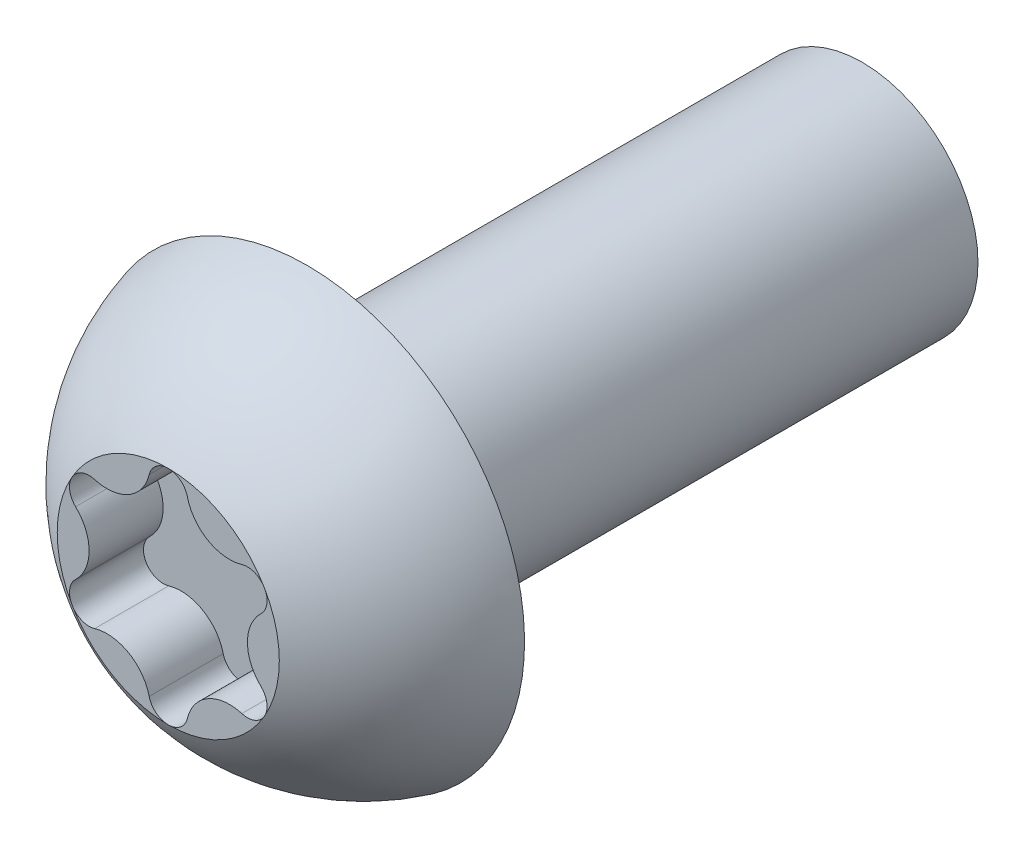
ISO-10303-21;
HEADER;
FILE_DESCRIPTION(('STEP AP214'),'2;1');
FILE_NAME('part.step','',(''),(''),'','','');
FILE_SCHEMA(('AUTOMOTIVE_DESIGN { 1 0 10303 214 1 1 1 1 }'));
ENDSEC;
DATA;
#1=APPLICATION_CONTEXT('core data for automotive mechanical design processes');
#2=APPLICATION_PROTOCOL_DEFINITION('international standard','automotive_design',2000,#1);
#3=PRODUCT_CONTEXT('',#1,'mechanical');
#4=PRODUCT('Part','Part','',(#3));
#5=PRODUCT_RELATED_PRODUCT_CATEGORY('part','',(#4));
#6=PRODUCT_DEFINITION_FORMATION('','',#4);
#7=PRODUCT_DEFINITION_CONTEXT('part definition',#1,'design');
#8=PRODUCT_DEFINITION('design','',#6,#7);
#9=PRODUCT_DEFINITION_SHAPE('','',#8);
#10=(LENGTH_UNIT() NAMED_UNIT(*) SI_UNIT(.MILLI.,.METRE.));
#11=(NAMED_UNIT(*) PLANE_ANGLE_UNIT() SI_UNIT($,.RADIAN.));
#12=(NAMED_UNIT(*) SI_UNIT($,.STERADIAN.) SOLID_ANGLE_UNIT());
#13=UNCERTAINTY_MEASURE_WITH_UNIT(LENGTH_MEASURE(1.E-05),#10,'distance_accuracy_value','');
#14=(GEOMETRIC_REPRESENTATION_CONTEXT(3) GLOBAL_UNCERTAINTY_ASSIGNED_CONTEXT((#13)) GLOBAL_UNIT_ASSIGNED_CONTEXT((#10,
#11,#12)) REPRESENTATION_CONTEXT('',''));
#15=CARTESIAN_POINT('',(0.,0.,0.));
#16=DIRECTION('',(0.,0.,1.));
#17=DIRECTION('',(1.,0.,0.));
#18=AXIS2_PLACEMENT_3D('',#15,#16,#17);
#19=CARTESIAN_POINT('',(0.,0.,1.5));
#20=DIRECTION('',(0.,0.,1.));
#21=DIRECTION('',(0.,-1.,0.));
#22=AXIS2_PLACEMENT_3D('',#19,#20,#21);
#23=PLANE('',#22);
#24=CARTESIAN_POINT('',(0.855459258295031,0.493899633057395,1.5));
#25=DIRECTION('',(0.,0.,1.));
#26=DIRECTION('',(-1.,0.,0.));
#27=AXIS2_PLACEMENT_3D('',#24,#25,#26);
#28=CIRCLE('',#27,0.212200733885212);
#29=CARTESIAN_POINT('',(1.0015261285454,0.339972309697685,1.5));
#30=VERTEX_POINT('',#29);
#31=CARTESIAN_POINT('',(1.03923048454133,0.600000000000001,1.5));
#32=VERTEX_POINT('',#31);
#33=EDGE_CURVE('E225',#30,#32,#28,.T.);
#34=ORIENTED_EDGE('',*,*,#33,.F.);
#35=CARTESIAN_POINT('',(1.32413741136024,0.,1.5));
#36=DIRECTION('',(0.,0.,-1.));
#37=DIRECTION('',(1.,0.,0.));
#38=AXIS2_PLACEMENT_3D('',#35,#36,#37);
#39=CIRCLE('',#38,0.468678153065207);
#40=CARTESIAN_POINT('',(1.0015261285454,-0.339972309697684,1.5));
#41=VERTEX_POINT('',#40);
#42=EDGE_CURVE('E221',#41,#30,#39,.T.);
#43=ORIENTED_EDGE('',*,*,#42,.F.);
#44=CARTESIAN_POINT('',(0.855459258295033,-0.493899633057393,1.5));
#45=DIRECTION('',(0.,0.,1.));
#46=DIRECTION('',(-1.,0.,0.));
#47=AXIS2_PLACEMENT_3D('',#44,#45,#46);
#48=CIRCLE('',#47,0.212200733885212);
#49=CARTESIAN_POINT('',(1.03923048454133,-0.599999999999999,1.5));
#50=VERTEX_POINT('',#49);
#51=EDGE_CURVE('E218',#50,#41,#48,.T.);
#52=ORIENTED_EDGE('',*,*,#51,.F.);
#53=CARTESIAN_POINT('',(0.,0.,1.5));
#54=DIRECTION('',(0.,0.,-1.));
#55=DIRECTION('',(0.,1.,0.));
#56=AXIS2_PLACEMENT_3D('',#53,#54,#55);
#57=CIRCLE('',#56,1.2);
#58=EDGE_CURVE('E47',#32,#50,#57,.T.);
#59=ORIENTED_EDGE('',*,*,#58,.F.);
#60=EDGE_LOOP('',(#34,#43,#52,#59));
#61=FACE_BOUND('',#60,.T.);
#62=ADVANCED_FACE('F39',(#61),#23,.T.);
#63=CARTESIAN_POINT('',(0.795187721054166,0.697360915025354,1.5));
#64=VERTEX_POINT('',#63);
#65=EDGE_CURVE('E224',#32,#64,#28,.T.);
#66=ORIENTED_EDGE('',*,*,#65,.F.);
#67=CARTESIAN_POINT('',(0.,1.2,1.5));
#68=VERTEX_POINT('',#67);
#69=EDGE_CURVE('E11',#68,#32,#57,.T.);
#70=ORIENTED_EDGE('',*,*,#69,.F.);
#71=CARTESIAN_POINT('',(0.,0.987799266114787,1.5));
#72=DIRECTION('',(0.,0.,1.));
#73=DIRECTION('',(-1.,0.,0.));
#74=AXIS2_PLACEMENT_3D('',#71,#72,#73);
#75=CIRCLE('',#74,0.212200733885212);
#76=CARTESIAN_POINT('',(0.206338407491235,1.03733322472304,1.5));
#77=VERTEX_POINT('',#76);
#78=EDGE_CURVE('E63',#77,#68,#75,.T.);
#79=ORIENTED_EDGE('',*,*,#78,.F.);
#80=CARTESIAN_POINT('',(0.662068705680119,1.14673663633933,1.5));
#81=DIRECTION('',(0.,0.,-1.));
#82=DIRECTION('',(1.,0.,0.));
#83=AXIS2_PLACEMENT_3D('',#80,#81,#82);
#84=CIRCLE('',#83,0.468678153065206);
#85=EDGE_CURVE('E227',#64,#77,#84,.T.);
#86=ORIENTED_EDGE('',*,*,#85,.F.);
#87=EDGE_LOOP('',(#66,#70,#79,#86));
#88=FACE_BOUND('',#87,.T.);
#89=ADVANCED_FACE('F310',(#88),#23,.T.);
#90=CARTESIAN_POINT('',(0.795187721054167,-0.697360915025353,1.5));
#91=VERTEX_POINT('',#90);
#92=EDGE_CURVE('E219',#91,#50,#48,.T.);
#93=ORIENTED_EDGE('',*,*,#92,.F.);
#94=CARTESIAN_POINT('',(0.662068705680121,-1.14673663633933,1.5));
#95=DIRECTION('',(0.,0.,-1.));
#96=DIRECTION('',(1.,0.,0.));
#97=AXIS2_PLACEMENT_3D('',#94,#95,#96);
#98=CIRCLE('',#97,0.468678153065207);
#99=CARTESIAN_POINT('',(0.206338407491237,-1.03733322472304,1.5));
#100=VERTEX_POINT('',#99);
#101=EDGE_CURVE('E215',#100,#91,#98,.T.);
#102=ORIENTED_EDGE('',*,*,#101,.F.);
#103=CARTESIAN_POINT('',(0.,-0.987799266114788,1.5));
#104=DIRECTION('',(0.,0.,1.));
#105=DIRECTION('',(-1.,0.,0.));
#106=AXIS2_PLACEMENT_3D('',#103,#104,#105);
#107=CIRCLE('',#106,0.212200733885213);
#108=CARTESIAN_POINT('',(0.,-1.2,1.5));
#109=VERTEX_POINT('',#108);
#110=EDGE_CURVE('E212',#109,#100,#107,.T.);
#111=ORIENTED_EDGE('',*,*,#110,.F.);
#112=EDGE_CURVE('E273',#50,#109,#57,.T.);
#113=ORIENTED_EDGE('',*,*,#112,.F.);
#114=EDGE_LOOP('',(#93,#102,#111,#113));
#115=FACE_BOUND('',#114,.T.);
#116=ADVANCED_FACE('F289',(#115),#23,.T.);
#117=CARTESIAN_POINT('',(-0.206338407491235,1.03733322472304,1.5));
#118=VERTEX_POINT('',#117);
#119=EDGE_CURVE('E172',#68,#118,#75,.T.);
#120=ORIENTED_EDGE('',*,*,#119,.F.);
#121=CARTESIAN_POINT('',(-1.03923048454133,0.599999999999999,1.5));
#122=VERTEX_POINT('',#121);
#123=EDGE_CURVE('E48',#122,#68,#57,.T.);
#124=ORIENTED_EDGE('',*,*,#123,.F.);
#125=CARTESIAN_POINT('',(-0.855459258295031,0.493899633057392,1.5));
#126=DIRECTION('',(0.,0.,1.));
#127=DIRECTION('',(-1.,0.,0.));
#128=AXIS2_PLACEMENT_3D('',#125,#126,#127);
#129=CIRCLE('',#128,0.212200733885212);
#130=CARTESIAN_POINT('',(-0.795187721054166,0.697360915025352,1.5));
#131=VERTEX_POINT('',#130);
#132=EDGE_CURVE('E55',#131,#122,#129,.T.);
#133=ORIENTED_EDGE('',*,*,#132,.F.);
#134=CARTESIAN_POINT('',(-0.662068705680119,1.14673663633933,1.5));
#135=DIRECTION('',(0.,0.,-1.));
#136=DIRECTION('',(1.,0.,0.));
#137=AXIS2_PLACEMENT_3D('',#134,#135,#136);
#138=CIRCLE('',#137,0.468678153065207);
#139=EDGE_CURVE('E155',#118,#131,#138,.T.);
#140=ORIENTED_EDGE('',*,*,#139,.F.);
#141=EDGE_LOOP('',(#120,#124,#133,#140));
#142=FACE_BOUND('',#141,.T.);
#143=ADVANCED_FACE('F302',(#142),#23,.T.);
#144=CARTESIAN_POINT('',(-0.206338407491233,-1.03733322472304,1.5));
#145=VERTEX_POINT('',#144);
#146=EDGE_CURVE('E213',#145,#109,#107,.T.);
#147=ORIENTED_EDGE('',*,*,#146,.F.);
#148=CARTESIAN_POINT('',(-0.662068705680117,-1.14673663633933,1.5));
#149=DIRECTION('',(0.,0.,-1.));
#150=DIRECTION('',(1.,0.,0.));
#151=AXIS2_PLACEMENT_3D('',#148,#149,#150);
#152=CIRCLE('',#151,0.468678153065206);
#153=CARTESIAN_POINT('',(-0.795187721054164,-0.697360915025355,1.5));
#154=VERTEX_POINT('',#153);
#155=EDGE_CURVE('E209',#154,#145,#152,.T.);
#156=ORIENTED_EDGE('',*,*,#155,.F.);
#157=CARTESIAN_POINT('',(-0.855459258295029,-0.493899633057395,1.5));
#158=DIRECTION('',(0.,0.,1.));
#159=DIRECTION('',(-1.,0.,0.));
#160=AXIS2_PLACEMENT_3D('',#157,#158,#159);
#161=CIRCLE('',#160,0.212200733885212);
#162=CARTESIAN_POINT('',(-1.03923048454132,-0.600000000000002,1.5));
#163=VERTEX_POINT('',#162);
#164=EDGE_CURVE('E206',#163,#154,#161,.T.);
#165=ORIENTED_EDGE('',*,*,#164,.F.);
#166=EDGE_CURVE('E270',#109,#163,#57,.T.);
#167=ORIENTED_EDGE('',*,*,#166,.F.);
#168=EDGE_LOOP('',(#147,#156,#165,#167));
#169=FACE_BOUND('',#168,.T.);
#170=ADVANCED_FACE('F295',(#169),#23,.T.);
#171=CARTESIAN_POINT('',(-1.0015261285454,-0.339972309697686,1.5));
#172=VERTEX_POINT('',#171);
#173=EDGE_CURVE('E207',#172,#163,#161,.T.);
#174=ORIENTED_EDGE('',*,*,#173,.F.);
#175=CARTESIAN_POINT('',(-1.32413741136024,0.,1.5));
#176=DIRECTION('',(0.,0.,-1.));
#177=DIRECTION('',(1.,0.,0.));
#178=AXIS2_PLACEMENT_3D('',#175,#176,#177);
#179=CIRCLE('',#178,0.468678153065206);
#180=CARTESIAN_POINT('',(-1.0015261285454,0.339972309697683,1.5));
#181=VERTEX_POINT('',#180);
#182=EDGE_CURVE('E203',#181,#172,#179,.T.);
#183=ORIENTED_EDGE('',*,*,#182,.F.);
#184=EDGE_CURVE('E201',#122,#181,#129,.T.);
#185=ORIENTED_EDGE('',*,*,#184,.F.);
#186=EDGE_CURVE('E265',#163,#122,#57,.T.);
#187=ORIENTED_EDGE('',*,*,#186,.F.);
#188=EDGE_LOOP('',(#174,#183,#185,#187));
#189=FACE_BOUND('',#188,.T.);
#190=ADVANCED_FACE('F41',(#189),#23,.T.);
#191=CARTESIAN_POINT('',(0.,0.,-0.610833333333334));
#192=DIRECTION('',(0.,0.,-1.));
#193=DIRECTION('',(0.,1.,0.));
#194=AXIS2_PLACEMENT_3D('',#191,#192,#193);
#195=SPHERICAL_SURFACE('',#194,2.42808924076343);
#196=ORIENTED_EDGE('',*,*,#69,.T.);
#197=ORIENTED_EDGE('',*,*,#58,.T.);
#198=ORIENTED_EDGE('',*,*,#112,.T.);
#199=ORIENTED_EDGE('',*,*,#166,.T.);
#200=ORIENTED_EDGE('',*,*,#186,.T.);
#201=ORIENTED_EDGE('',*,*,#123,.T.);
#202=EDGE_LOOP('',(#196,#197,#198,#199,#200,#201));
#203=FACE_BOUND('',#202,.T.);
#204=CARTESIAN_POINT('',(0.,0.,0.));
#205=DIRECTION('',(0.,0.,-1.));
#206=DIRECTION('',(0.,1.,0.));
#207=AXIS2_PLACEMENT_3D('',#204,#205,#206);
#208=CIRCLE('',#207,2.35);
#209=CARTESIAN_POINT('',(0.,2.35,0.));
#210=VERTEX_POINT('',#209);
#211=EDGE_CURVE('E260',#210,#210,#208,.T.);
#212=ORIENTED_EDGE('',*,*,#211,.F.);
#213=EDGE_LOOP('',(#212));
#214=FACE_BOUND('',#213,.T.);
#215=ADVANCED_FACE('F279',(#203,#214),#195,.T.);
#216=CARTESIAN_POINT('',(0.,2.35,0.));
#217=DIRECTION('',(0.,0.,-1.));
#218=DIRECTION('',(0.,1.,0.));
#219=AXIS2_PLACEMENT_3D('',#216,#217,#218);
#220=PLANE('',#219);
#221=ORIENTED_EDGE('',*,*,#211,.T.);
#222=EDGE_LOOP('',(#221));
#223=FACE_BOUND('',#222,.T.);
#224=CARTESIAN_POINT('',(0.,0.,0.));
#225=DIRECTION('',(0.,0.,-1.));
#226=DIRECTION('',(0.,1.,0.));
#227=AXIS2_PLACEMENT_3D('',#224,#225,#226);
#228=CIRCLE('',#227,1.25);
#229=CARTESIAN_POINT('',(0.,1.25,0.));
#230=VERTEX_POINT('',#229);
#231=EDGE_CURVE('E258',#230,#230,#228,.T.);
#232=ORIENTED_EDGE('',*,*,#231,.F.);
#233=EDGE_LOOP('',(#232));
#234=FACE_BOUND('',#233,.T.);
#235=ADVANCED_FACE('F348',(#223,#234),#220,.T.);
#236=CARTESIAN_POINT('',(0.,0.,1.5));
#237=DIRECTION('',(0.,0.,-1.));
#238=DIRECTION('',(0.,1.,0.));
#239=AXIS2_PLACEMENT_3D('',#236,#237,#238);
#240=CYLINDRICAL_SURFACE('',#239,1.25);
#241=ORIENTED_EDGE('',*,*,#231,.T.);
#242=EDGE_LOOP('',(#241));
#243=FACE_BOUND('',#242,.T.);
#244=CARTESIAN_POINT('',(0.,0.,-6.));
#245=DIRECTION('',(0.,0.,-1.));
#246=DIRECTION('',(0.,1.,0.));
#247=AXIS2_PLACEMENT_3D('',#244,#245,#246);
#248=CIRCLE('',#247,1.25);
#249=CARTESIAN_POINT('',(0.,1.25,-6.));
#250=VERTEX_POINT('',#249);
#251=EDGE_CURVE('E232',#250,#250,#248,.T.);
#252=ORIENTED_EDGE('',*,*,#251,.F.);
#253=EDGE_LOOP('',(#252));
#254=FACE_BOUND('',#253,.T.);
#255=ADVANCED_FACE('F376',(#243,#254),#240,.T.);
#256=CARTESIAN_POINT('',(0.,1.25,-6.));
#257=DIRECTION('',(0.,0.,-1.));
#258=DIRECTION('',(0.,1.,0.));
#259=AXIS2_PLACEMENT_3D('',#256,#257,#258);
#260=PLANE('',#259);
#261=ORIENTED_EDGE('',*,*,#251,.T.);
#262=EDGE_LOOP('',(#261));
#263=FACE_BOUND('',#262,.T.);
#264=ADVANCED_FACE('F371',(#263),#260,.T.);
#265=CARTESIAN_POINT('',(-0.662068705680119,1.14673663633933,0.7));
#266=DIRECTION('',(0.,0.,1.));
#267=DIRECTION('',(1.,0.,0.));
#268=AXIS2_PLACEMENT_3D('',#265,#266,#267);
#269=CYLINDRICAL_SURFACE('',#268,0.468678153065207);
#270=ORIENTED_EDGE('',*,*,#139,.T.);
#271=DIRECTION('',(0.,0.,1.));
#272=VECTOR('',#271,1.);
#273=CARTESIAN_POINT('',(-0.795187721054166,0.697360915025352,0.7));
#274=LINE('',#273,#272);
#275=CARTESIAN_POINT('',(-0.795187721054166,0.697360915025352,0.7));
#276=VERTEX_POINT('',#275);
#277=EDGE_CURVE('E147',#276,#131,#274,.T.);
#278=ORIENTED_EDGE('',*,*,#277,.F.);
#279=CARTESIAN_POINT('',(-0.662068705680119,1.14673663633933,0.7));
#280=DIRECTION('',(0.,0.,-1.));
#281=DIRECTION('',(1.,0.,0.));
#282=AXIS2_PLACEMENT_3D('',#279,#280,#281);
#283=CIRCLE('',#282,0.468678153065207);
#284=CARTESIAN_POINT('',(-0.206338407491235,1.03733322472304,0.7));
#285=VERTEX_POINT('',#284);
#286=EDGE_CURVE('E152',#285,#276,#283,.T.);
#287=ORIENTED_EDGE('',*,*,#286,.F.);
#288=DIRECTION('',(0.,0.,1.));
#289=VECTOR('',#288,1.);
#290=CARTESIAN_POINT('',(-0.206338407491235,1.03733322472304,0.7));
#291=LINE('',#290,#289);
#292=EDGE_CURVE('E230',#285,#118,#291,.T.);
#293=ORIENTED_EDGE('',*,*,#292,.T.);
#294=EDGE_LOOP('',(#270,#278,#287,#293));
#295=FACE_BOUND('',#294,.T.);
#296=ADVANCED_FACE('F149',(#295),#269,.T.);
#297=CARTESIAN_POINT('',(0.,0.987799266114787,0.7));
#298=DIRECTION('',(0.,0.,1.));
#299=DIRECTION('',(1.,0.,0.));
#300=AXIS2_PLACEMENT_3D('',#297,#298,#299);
#301=CYLINDRICAL_SURFACE('',#300,0.212200733885212);
#302=ORIENTED_EDGE('',*,*,#78,.T.);
#303=ORIENTED_EDGE('',*,*,#119,.T.);
#304=ORIENTED_EDGE('',*,*,#292,.F.);
#305=CARTESIAN_POINT('',(0.,0.987799266114787,0.7));
#306=DIRECTION('',(0.,0.,1.));
#307=DIRECTION('',(-1.,0.,0.));
#308=AXIS2_PLACEMENT_3D('',#305,#306,#307);
#309=CIRCLE('',#308,0.212200733885212);
#310=CARTESIAN_POINT('',(0.206338407491235,1.03733322472304,0.7));
#311=VERTEX_POINT('',#310);
#312=EDGE_CURVE('E157',#311,#285,#309,.T.);
#313=ORIENTED_EDGE('',*,*,#312,.F.);
#314=DIRECTION('',(0.,0.,1.));
#315=VECTOR('',#314,1.);
#316=CARTESIAN_POINT('',(0.206338407491235,1.03733322472304,0.7));
#317=LINE('',#316,#315);
#318=EDGE_CURVE('E233',#311,#77,#317,.T.);
#319=ORIENTED_EDGE('',*,*,#318,.T.);
#320=EDGE_LOOP('',(#302,#303,#304,#313,#319));
#321=FACE_BOUND('',#320,.T.);
#322=ADVANCED_FACE('F303',(#321),#301,.F.);
#323=CARTESIAN_POINT('',(0.662068705680119,1.14673663633933,0.7));
#324=DIRECTION('',(0.,0.,1.));
#325=DIRECTION('',(1.,0.,0.));
#326=AXIS2_PLACEMENT_3D('',#323,#324,#325);
#327=CYLINDRICAL_SURFACE('',#326,0.468678153065206);
#328=ORIENTED_EDGE('',*,*,#85,.T.);
#329=ORIENTED_EDGE('',*,*,#318,.F.);
#330=CARTESIAN_POINT('',(0.662068705680119,1.14673663633933,0.7));
#331=DIRECTION('',(0.,0.,-1.));
#332=DIRECTION('',(1.,0.,0.));
#333=AXIS2_PLACEMENT_3D('',#330,#331,#332);
#334=CIRCLE('',#333,0.468678153065206);
#335=CARTESIAN_POINT('',(0.795187721054166,0.697360915025354,0.7));
#336=VERTEX_POINT('',#335);
#337=EDGE_CURVE('E197',#336,#311,#334,.T.);
#338=ORIENTED_EDGE('',*,*,#337,.F.);
#339=DIRECTION('',(0.,0.,1.));
#340=VECTOR('',#339,1.);
#341=CARTESIAN_POINT('',(0.795187721054166,0.697360915025354,0.7));
#342=LINE('',#341,#340);
#343=EDGE_CURVE('E235',#336,#64,#342,.T.);
#344=ORIENTED_EDGE('',*,*,#343,.T.);
#345=EDGE_LOOP('',(#328,#329,#338,#344));
#346=FACE_BOUND('',#345,.T.);
#347=ADVANCED_FACE('F307',(#346),#327,.T.);
#348=CARTESIAN_POINT('',(0.855459258295031,0.493899633057395,0.7));
#349=DIRECTION('',(0.,0.,1.));
#350=DIRECTION('',(1.,0.,0.));
#351=AXIS2_PLACEMENT_3D('',#348,#349,#350);
#352=CYLINDRICAL_SURFACE('',#351,0.212200733885212);
#353=ORIENTED_EDGE('',*,*,#33,.T.);
#354=ORIENTED_EDGE('',*,*,#65,.T.);
#355=ORIENTED_EDGE('',*,*,#343,.F.);
#356=CARTESIAN_POINT('',(0.855459258295031,0.493899633057395,0.7));
#357=DIRECTION('',(0.,0.,1.));
#358=DIRECTION('',(-1.,0.,0.));
#359=AXIS2_PLACEMENT_3D('',#356,#357,#358);
#360=CIRCLE('',#359,0.212200733885212);
#361=CARTESIAN_POINT('',(1.0015261285454,0.339972309697685,0.7));
#362=VERTEX_POINT('',#361);
#363=EDGE_CURVE('E194',#362,#336,#360,.T.);
#364=ORIENTED_EDGE('',*,*,#363,.F.);
#365=DIRECTION('',(0.,0.,1.));
#366=VECTOR('',#365,1.);
#367=CARTESIAN_POINT('',(1.0015261285454,0.339972309697685,0.7));
#368=LINE('',#367,#366);
#369=EDGE_CURVE('E238',#362,#30,#368,.T.);
#370=ORIENTED_EDGE('',*,*,#369,.T.);
#371=EDGE_LOOP('',(#353,#354,#355,#364,#370));
#372=FACE_BOUND('',#371,.T.);
#373=ADVANCED_FACE('F312',(#372),#352,.F.);
#374=CARTESIAN_POINT('',(1.32413741136024,0.,0.7));
#375=DIRECTION('',(0.,0.,1.));
#376=DIRECTION('',(1.,0.,0.));
#377=AXIS2_PLACEMENT_3D('',#374,#375,#376);
#378=CYLINDRICAL_SURFACE('',#377,0.468678153065207);
#379=ORIENTED_EDGE('',*,*,#42,.T.);
#380=ORIENTED_EDGE('',*,*,#369,.F.);
#381=CARTESIAN_POINT('',(1.32413741136024,0.,0.7));
#382=DIRECTION('',(0.,0.,-1.));
#383=DIRECTION('',(1.,0.,0.));
#384=AXIS2_PLACEMENT_3D('',#381,#382,#383);
#385=CIRCLE('',#384,0.468678153065207);
#386=CARTESIAN_POINT('',(1.0015261285454,-0.339972309697684,0.7));
#387=VERTEX_POINT('',#386);
#388=EDGE_CURVE('E191',#387,#362,#385,.T.);
#389=ORIENTED_EDGE('',*,*,#388,.F.);
#390=DIRECTION('',(0.,0.,1.));
#391=VECTOR('',#390,1.);
#392=CARTESIAN_POINT('',(1.0015261285454,-0.339972309697684,0.7));
#393=LINE('',#392,#391);
#394=EDGE_CURVE('E240',#387,#41,#393,.T.);
#395=ORIENTED_EDGE('',*,*,#394,.T.);
#396=EDGE_LOOP('',(#379,#380,#389,#395));
#397=FACE_BOUND('',#396,.T.);
#398=ADVANCED_FACE('F316',(#397),#378,.T.);
#399=CARTESIAN_POINT('',(0.855459258295033,-0.493899633057393,0.7));
#400=DIRECTION('',(0.,0.,1.));
#401=DIRECTION('',(1.,0.,0.));
#402=AXIS2_PLACEMENT_3D('',#399,#400,#401);
#403=CYLINDRICAL_SURFACE('',#402,0.212200733885212);
#404=ORIENTED_EDGE('',*,*,#92,.T.);
#405=ORIENTED_EDGE('',*,*,#51,.T.);
#406=ORIENTED_EDGE('',*,*,#394,.F.);
#407=CARTESIAN_POINT('',(0.855459258295033,-0.493899633057393,0.7));
#408=DIRECTION('',(0.,0.,1.));
#409=DIRECTION('',(-1.,0.,0.));
#410=AXIS2_PLACEMENT_3D('',#407,#408,#409);
#411=CIRCLE('',#410,0.212200733885212);
#412=CARTESIAN_POINT('',(0.795187721054167,-0.697360915025353,0.7));
#413=VERTEX_POINT('',#412);
#414=EDGE_CURVE('E188',#413,#387,#411,.T.);
#415=ORIENTED_EDGE('',*,*,#414,.F.);
#416=DIRECTION('',(0.,0.,1.));
#417=VECTOR('',#416,1.);
#418=CARTESIAN_POINT('',(0.795187721054167,-0.697360915025353,0.7));
#419=LINE('',#418,#417);
#420=EDGE_CURVE('E243',#413,#91,#419,.T.);
#421=ORIENTED_EDGE('',*,*,#420,.T.);
#422=EDGE_LOOP('',(#404,#405,#406,#415,#421));
#423=FACE_BOUND('',#422,.T.);
#424=ADVANCED_FACE('F318',(#423),#403,.F.);
#425=CARTESIAN_POINT('',(0.662068705680121,-1.14673663633933,0.7));
#426=DIRECTION('',(0.,0.,1.));
#427=DIRECTION('',(1.,0.,0.));
#428=AXIS2_PLACEMENT_3D('',#425,#426,#427);
#429=CYLINDRICAL_SURFACE('',#428,0.468678153065207);
#430=ORIENTED_EDGE('',*,*,#101,.T.);
#431=ORIENTED_EDGE('',*,*,#420,.F.);
#432=CARTESIAN_POINT('',(0.662068705680121,-1.14673663633933,0.7));
#433=DIRECTION('',(0.,0.,-1.));
#434=DIRECTION('',(1.,0.,0.));
#435=AXIS2_PLACEMENT_3D('',#432,#433,#434);
#436=CIRCLE('',#435,0.468678153065207);
#437=CARTESIAN_POINT('',(0.206338407491237,-1.03733322472304,0.7));
#438=VERTEX_POINT('',#437);
#439=EDGE_CURVE('E185',#438,#413,#436,.T.);
#440=ORIENTED_EDGE('',*,*,#439,.F.);
#441=DIRECTION('',(0.,0.,1.));
#442=VECTOR('',#441,1.);
#443=CARTESIAN_POINT('',(0.206338407491237,-1.03733322472304,0.7));
#444=LINE('',#443,#442);
#445=EDGE_CURVE('E245',#438,#100,#444,.T.);
#446=ORIENTED_EDGE('',*,*,#445,.T.);
#447=EDGE_LOOP('',(#430,#431,#440,#446));
#448=FACE_BOUND('',#447,.T.);
#449=ADVANCED_FACE('F322',(#448),#429,.T.);
#450=CARTESIAN_POINT('',(0.,-0.987799266114788,0.7));
#451=DIRECTION('',(0.,0.,1.));
#452=DIRECTION('',(1.,0.,0.));
#453=AXIS2_PLACEMENT_3D('',#450,#451,#452);
#454=CYLINDRICAL_SURFACE('',#453,0.212200733885213);
#455=ORIENTED_EDGE('',*,*,#146,.T.);
#456=ORIENTED_EDGE('',*,*,#110,.T.);
#457=ORIENTED_EDGE('',*,*,#445,.F.);
#458=CARTESIAN_POINT('',(0.,-0.987799266114788,0.7));
#459=DIRECTION('',(0.,0.,1.));
#460=DIRECTION('',(-1.,0.,0.));
#461=AXIS2_PLACEMENT_3D('',#458,#459,#460);
#462=CIRCLE('',#461,0.212200733885213);
#463=CARTESIAN_POINT('',(-0.206338407491233,-1.03733322472304,0.7));
#464=VERTEX_POINT('',#463);
#465=EDGE_CURVE('E182',#464,#438,#462,.T.);
#466=ORIENTED_EDGE('',*,*,#465,.F.);
#467=DIRECTION('',(0.,0.,1.));
#468=VECTOR('',#467,1.);
#469=CARTESIAN_POINT('',(-0.206338407491233,-1.03733322472304,0.7));
#470=LINE('',#469,#468);
#471=EDGE_CURVE('E248',#464,#145,#470,.T.);
#472=ORIENTED_EDGE('',*,*,#471,.T.);
#473=EDGE_LOOP('',(#455,#456,#457,#466,#472));
#474=FACE_BOUND('',#473,.T.);
#475=ADVANCED_FACE('F323',(#474),#454,.F.);
#476=CARTESIAN_POINT('',(-0.662068705680117,-1.14673663633933,0.7));
#477=DIRECTION('',(0.,0.,1.));
#478=DIRECTION('',(1.,0.,0.));
#479=AXIS2_PLACEMENT_3D('',#476,#477,#478);
#480=CYLINDRICAL_SURFACE('',#479,0.468678153065206);
#481=ORIENTED_EDGE('',*,*,#155,.T.);
#482=ORIENTED_EDGE('',*,*,#471,.F.);
#483=CARTESIAN_POINT('',(-0.662068705680117,-1.14673663633933,0.7));
#484=DIRECTION('',(0.,0.,-1.));
#485=DIRECTION('',(1.,0.,0.));
#486=AXIS2_PLACEMENT_3D('',#483,#484,#485);
#487=CIRCLE('',#486,0.468678153065206);
#488=CARTESIAN_POINT('',(-0.795187721054164,-0.697360915025355,0.7));
#489=VERTEX_POINT('',#488);
#490=EDGE_CURVE('E179',#489,#464,#487,.T.);
#491=ORIENTED_EDGE('',*,*,#490,.F.);
#492=DIRECTION('',(0.,0.,1.));
#493=VECTOR('',#492,1.);
#494=CARTESIAN_POINT('',(-0.795187721054164,-0.697360915025355,0.7));
#495=LINE('',#494,#493);
#496=EDGE_CURVE('E250',#489,#154,#495,.T.);
#497=ORIENTED_EDGE('',*,*,#496,.T.);
#498=EDGE_LOOP('',(#481,#482,#491,#497));
#499=FACE_BOUND('',#498,.T.);
#500=ADVANCED_FACE('F327',(#499),#480,.T.);
#501=CARTESIAN_POINT('',(-0.855459258295029,-0.493899633057395,0.7));
#502=DIRECTION('',(0.,0.,1.));
#503=DIRECTION('',(1.,0.,0.));
#504=AXIS2_PLACEMENT_3D('',#501,#502,#503);
#505=CYLINDRICAL_SURFACE('',#504,0.212200733885212);
#506=ORIENTED_EDGE('',*,*,#173,.T.);
#507=ORIENTED_EDGE('',*,*,#164,.T.);
#508=ORIENTED_EDGE('',*,*,#496,.F.);
#509=CARTESIAN_POINT('',(-0.855459258295029,-0.493899633057395,0.7));
#510=DIRECTION('',(0.,0.,1.));
#511=DIRECTION('',(-1.,0.,0.));
#512=AXIS2_PLACEMENT_3D('',#509,#510,#511);
#513=CIRCLE('',#512,0.212200733885212);
#514=CARTESIAN_POINT('',(-1.0015261285454,-0.339972309697686,0.7));
#515=VERTEX_POINT('',#514);
#516=EDGE_CURVE('E176',#515,#489,#513,.T.);
#517=ORIENTED_EDGE('',*,*,#516,.F.);
#518=DIRECTION('',(0.,0.,1.));
#519=VECTOR('',#518,1.);
#520=CARTESIAN_POINT('',(-1.0015261285454,-0.339972309697686,0.7));
#521=LINE('',#520,#519);
#522=EDGE_CURVE('E253',#515,#172,#521,.T.);
#523=ORIENTED_EDGE('',*,*,#522,.T.);
#524=EDGE_LOOP('',(#506,#507,#508,#517,#523));
#525=FACE_BOUND('',#524,.T.);
#526=ADVANCED_FACE('F328',(#525),#505,.F.);
#527=CARTESIAN_POINT('',(-1.32413741136024,0.,0.7));
#528=DIRECTION('',(0.,0.,1.));
#529=DIRECTION('',(1.,0.,0.));
#530=AXIS2_PLACEMENT_3D('',#527,#528,#529);
#531=CYLINDRICAL_SURFACE('',#530,0.468678153065206);
#532=ORIENTED_EDGE('',*,*,#182,.T.);
#533=ORIENTED_EDGE('',*,*,#522,.F.);
#534=CARTESIAN_POINT('',(-1.32413741136024,0.,0.7));
#535=DIRECTION('',(0.,0.,-1.));
#536=DIRECTION('',(1.,0.,0.));
#537=AXIS2_PLACEMENT_3D('',#534,#535,#536);
#538=CIRCLE('',#537,0.468678153065206);
#539=CARTESIAN_POINT('',(-1.0015261285454,0.339972309697683,0.7));
#540=VERTEX_POINT('',#539);
#541=EDGE_CURVE('E166',#540,#515,#538,.T.);
#542=ORIENTED_EDGE('',*,*,#541,.F.);
#543=DIRECTION('',(0.,0.,1.));
#544=VECTOR('',#543,1.);
#545=CARTESIAN_POINT('',(-1.0015261285454,0.339972309697683,0.7));
#546=LINE('',#545,#544);
#547=EDGE_CURVE('E156',#540,#181,#546,.T.);
#548=ORIENTED_EDGE('',*,*,#547,.T.);
#549=EDGE_LOOP('',(#532,#533,#542,#548));
#550=FACE_BOUND('',#549,.T.);
#551=ADVANCED_FACE('F330',(#550),#531,.T.);
#552=CARTESIAN_POINT('',(-0.855459258295031,0.493899633057392,0.7));
#553=DIRECTION('',(0.,0.,1.));
#554=DIRECTION('',(1.,0.,0.));
#555=AXIS2_PLACEMENT_3D('',#552,#553,#554);
#556=CYLINDRICAL_SURFACE('',#555,0.212200733885212);
#557=ORIENTED_EDGE('',*,*,#132,.T.);
#558=ORIENTED_EDGE('',*,*,#184,.T.);
#559=ORIENTED_EDGE('',*,*,#547,.F.);
#560=CARTESIAN_POINT('',(-0.855459258295031,0.493899633057392,0.7));
#561=DIRECTION('',(0.,0.,1.));
#562=DIRECTION('',(-1.,0.,0.));
#563=AXIS2_PLACEMENT_3D('',#560,#561,#562);
#564=CIRCLE('',#563,0.212200733885212);
#565=EDGE_CURVE('E160',#276,#540,#564,.T.);
#566=ORIENTED_EDGE('',*,*,#565,.F.);
#567=ORIENTED_EDGE('',*,*,#277,.T.);
#568=EDGE_LOOP('',(#557,#558,#559,#566,#567));
#569=FACE_BOUND('',#568,.T.);
#570=ADVANCED_FACE('F161',(#569),#556,.F.);
#571=CARTESIAN_POINT('',(-0.33103435284006,1.06726795122706,0.7));
#572=DIRECTION('',(0.,0.,1.));
#573=DIRECTION('',(1.,0.,0.));
#574=AXIS2_PLACEMENT_3D('',#571,#572,#573);
#575=PLANE('',#574);
#576=ORIENTED_EDGE('',*,*,#286,.T.);
#577=ORIENTED_EDGE('',*,*,#565,.T.);
#578=ORIENTED_EDGE('',*,*,#541,.T.);
#579=ORIENTED_EDGE('',*,*,#516,.T.);
#580=ORIENTED_EDGE('',*,*,#490,.T.);
#581=ORIENTED_EDGE('',*,*,#465,.T.);
#582=ORIENTED_EDGE('',*,*,#439,.T.);
#583=ORIENTED_EDGE('',*,*,#414,.T.);
#584=ORIENTED_EDGE('',*,*,#388,.T.);
#585=ORIENTED_EDGE('',*,*,#363,.T.);
#586=ORIENTED_EDGE('',*,*,#337,.T.);
#587=ORIENTED_EDGE('',*,*,#312,.T.);
#588=EDGE_LOOP('',(#576,#577,#578,#579,#580,#581,#582,#583,#584,#585,#586,#587));
#589=FACE_BOUND('',#588,.T.);
#590=ADVANCED_FACE('F168',(#589),#575,.T.);
#591=CLOSED_SHELL('',(#62,#89,#116,#143,#170,#190,#215,#235,#255,#264,#296,#322,#347,#373,#398,
#424,#449,#475,#500,#526,#551,#570,#590));
#592=MANIFOLD_SOLID_BREP('B2',#591);
#593=ADVANCED_BREP_SHAPE_REPRESENTATION('',(#18,#592),#14);
#594=SHAPE_DEFINITION_REPRESENTATION(#9,#593);
ENDSEC;
END-ISO-10303-21;
